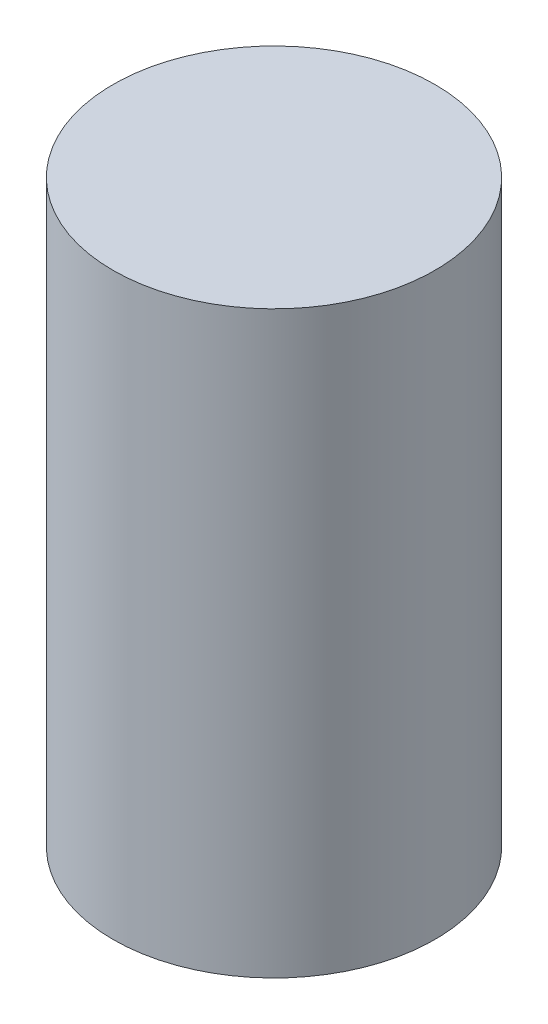
ISO-10303-21;
HEADER;
FILE_DESCRIPTION(('STEP AP214'),'2;1');
FILE_NAME('part.step','',(''),(''),'','','');
FILE_SCHEMA(('AUTOMOTIVE_DESIGN { 1 0 10303 214 1 1 1 1 }'));
ENDSEC;
DATA;
#1=APPLICATION_CONTEXT('core data for automotive mechanical design processes');
#2=APPLICATION_PROTOCOL_DEFINITION('international standard','automotive_design',2000,#1);
#3=PRODUCT_CONTEXT('',#1,'mechanical');
#4=PRODUCT('Part','Part','',(#3));
#5=PRODUCT_RELATED_PRODUCT_CATEGORY('part','',(#4));
#6=PRODUCT_DEFINITION_FORMATION('','',#4);
#7=PRODUCT_DEFINITION_CONTEXT('part definition',#1,'design');
#8=PRODUCT_DEFINITION('design','',#6,#7);
#9=PRODUCT_DEFINITION_SHAPE('','',#8);
#10=(LENGTH_UNIT() NAMED_UNIT(*) SI_UNIT(.MILLI.,.METRE.));
#11=(NAMED_UNIT(*) PLANE_ANGLE_UNIT() SI_UNIT($,.RADIAN.));
#12=(NAMED_UNIT(*) SI_UNIT($,.STERADIAN.) SOLID_ANGLE_UNIT());
#13=UNCERTAINTY_MEASURE_WITH_UNIT(LENGTH_MEASURE(1.E-05),#10,'distance_accuracy_value','');
#14=(GEOMETRIC_REPRESENTATION_CONTEXT(3) GLOBAL_UNCERTAINTY_ASSIGNED_CONTEXT((#13)) GLOBAL_UNIT_ASSIGNED_CONTEXT((#10,
#11,#12)) REPRESENTATION_CONTEXT('',''));
#15=CARTESIAN_POINT('',(0.,0.,0.));
#16=DIRECTION('',(0.,0.,1.));
#17=DIRECTION('',(1.,0.,0.));
#18=AXIS2_PLACEMENT_3D('',#15,#16,#17);
#19=CARTESIAN_POINT('',(0.,54.,0.));
#20=DIRECTION('',(0.,-1.,0.));
#21=DIRECTION('',(0.,0.,-1.));
#22=AXIS2_PLACEMENT_3D('',#19,#20,#21);
#23=CYLINDRICAL_SURFACE('',#22,15.);
#24=CARTESIAN_POINT('',(0.,54.,0.));
#25=DIRECTION('',(0.,1.,0.));
#26=DIRECTION('',(0.,0.,1.));
#27=AXIS2_PLACEMENT_3D('',#24,#25,#26);
#28=CIRCLE('',#27,15.);
#29=CARTESIAN_POINT('',(0.,54.,15.));
#30=VERTEX_POINT('',#29);
#31=EDGE_CURVE('E10',#30,#30,#28,.T.);
#32=ORIENTED_EDGE('',*,*,#31,.F.);
#33=EDGE_LOOP('',(#32));
#34=FACE_BOUND('',#33,.T.);
#35=CARTESIAN_POINT('',(0.,0.,0.));
#36=DIRECTION('',(0.,1.,0.));
#37=DIRECTION('',(0.,0.,1.));
#38=AXIS2_PLACEMENT_3D('',#35,#36,#37);
#39=CIRCLE('',#38,15.);
#40=CARTESIAN_POINT('',(0.,0.,15.));
#41=VERTEX_POINT('',#40);
#42=EDGE_CURVE('E36',#41,#41,#39,.T.);
#43=ORIENTED_EDGE('',*,*,#42,.T.);
#44=EDGE_LOOP('',(#43));
#45=FACE_BOUND('',#44,.T.);
#46=ADVANCED_FACE('F33',(#34,#45),#23,.T.);
#47=CARTESIAN_POINT('',(0.,54.,0.));
#48=DIRECTION('',(0.,1.,0.));
#49=DIRECTION('',(0.,0.,1.));
#50=AXIS2_PLACEMENT_3D('',#47,#48,#49);
#51=PLANE('',#50);
#52=ORIENTED_EDGE('',*,*,#31,.T.);
#53=EDGE_LOOP('',(#52));
#54=FACE_BOUND('',#53,.T.);
#55=ADVANCED_FACE('F48',(#54),#51,.T.);
#56=CARTESIAN_POINT('',(0.,0.,0.));
#57=DIRECTION('',(0.,1.,0.));
#58=DIRECTION('',(0.,0.,1.));
#59=AXIS2_PLACEMENT_3D('',#56,#57,#58);
#60=PLANE('',#59);
#61=ORIENTED_EDGE('',*,*,#42,.F.);
#62=EDGE_LOOP('',(#61));
#63=FACE_BOUND('',#62,.T.);
#64=ADVANCED_FACE('F46',(#63),#60,.F.);
#65=CLOSED_SHELL('',(#46,#55,#64));
#66=MANIFOLD_SOLID_BREP('B2',#65);
#67=ADVANCED_BREP_SHAPE_REPRESENTATION('',(#18,#66),#14);
#68=SHAPE_DEFINITION_REPRESENTATION(#9,#67);
ENDSEC;
END-ISO-10303-21;
